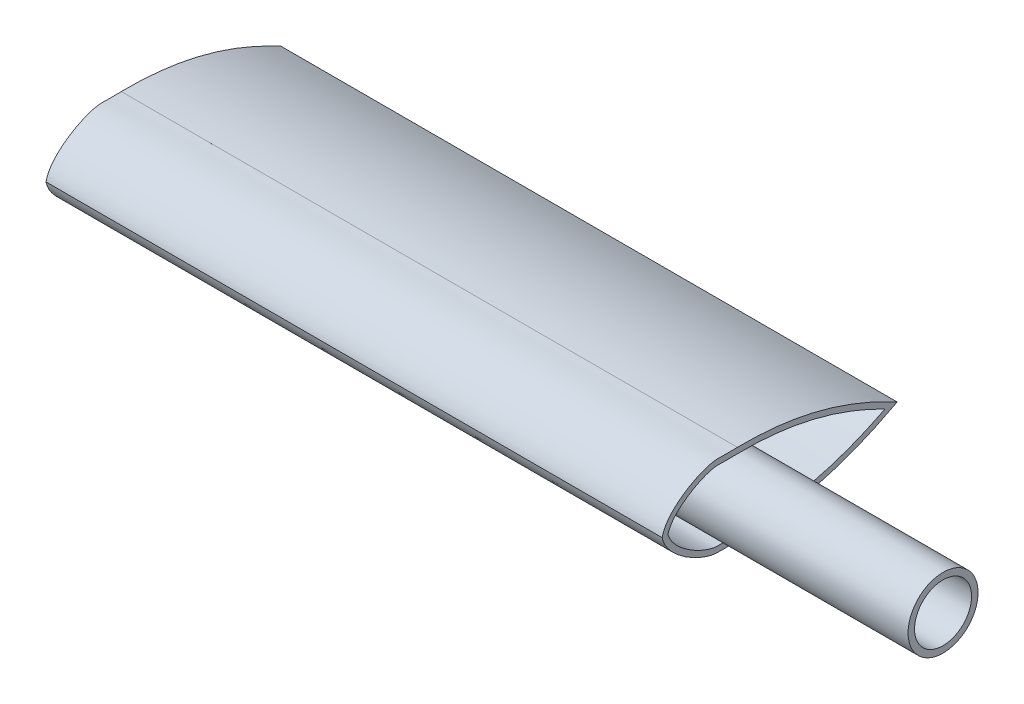
ISO-10303-21;
HEADER;
FILE_DESCRIPTION(('STEP AP214'),'2;1');
FILE_NAME('part.step','',(''),(''),'','','');
FILE_SCHEMA(('AUTOMOTIVE_DESIGN { 1 0 10303 214 1 1 1 1 }'));
ENDSEC;
DATA;
#1=APPLICATION_CONTEXT('core data for automotive mechanical design processes');
#2=APPLICATION_PROTOCOL_DEFINITION('international standard','automotive_design',2000,#1);
#3=PRODUCT_CONTEXT('',#1,'mechanical');
#4=PRODUCT('Part','Part','',(#3));
#5=PRODUCT_RELATED_PRODUCT_CATEGORY('part','',(#4));
#6=PRODUCT_DEFINITION_FORMATION('','',#4);
#7=PRODUCT_DEFINITION_CONTEXT('part definition',#1,'design');
#8=PRODUCT_DEFINITION('design','',#6,#7);
#9=PRODUCT_DEFINITION_SHAPE('','',#8);
#10=(LENGTH_UNIT() NAMED_UNIT(*) SI_UNIT(.MILLI.,.METRE.));
#11=(NAMED_UNIT(*) PLANE_ANGLE_UNIT() SI_UNIT($,.RADIAN.));
#12=(NAMED_UNIT(*) SI_UNIT($,.STERADIAN.) SOLID_ANGLE_UNIT());
#13=UNCERTAINTY_MEASURE_WITH_UNIT(LENGTH_MEASURE(1.E-05),#10,'distance_accuracy_value','');
#14=(GEOMETRIC_REPRESENTATION_CONTEXT(3) GLOBAL_UNCERTAINTY_ASSIGNED_CONTEXT((#13)) GLOBAL_UNIT_ASSIGNED_CONTEXT((#10,
#11,#12)) REPRESENTATION_CONTEXT('',''));
#15=CARTESIAN_POINT('',(0.,0.,0.));
#16=DIRECTION('',(0.,0.,1.));
#17=DIRECTION('',(1.,0.,0.));
#18=AXIS2_PLACEMENT_3D('',#15,#16,#17);
#19=CARTESIAN_POINT('',(52.02535704593,9.20715614920474,0.0324189138582508));
#20=CARTESIAN_POINT('',(52.02535704593,9.2545678789651,-3.12152695135499));
#21=CARTESIAN_POINT('',(52.02535704593,9.11059405651158,-6.26810860237042));
#22=CARTESIAN_POINT('',(52.02535704593,8.56973641400707,-10.9681085023738));
#23=CARTESIAN_POINT('',(52.02535704593,8.33627501275821,-12.5252170595591));
#24=CARTESIAN_POINT('',(52.02535704593,7.76137535616036,-15.6200257885336));
#25=CARTESIAN_POINT('',(52.02535704593,7.41957392528799,-17.1590894187303));
#26=CARTESIAN_POINT('',(52.02535704593,6.23425482299172,-21.7380864808637));
#27=CARTESIAN_POINT('',(52.02535704593,5.23448895790792,-24.724357096829));
#28=CARTESIAN_POINT('',(52.02535704593,3.45107168212743,-29.1057516055092));
#29=CARTESIAN_POINT('',(52.02535704593,2.8115402581163,-30.5449777205745));
#30=CARTESIAN_POINT('',(52.02535704593,1.79028170997367,-32.67461115866));
#31=CARTESIAN_POINT('',(52.02535704593,1.43867214479019,-33.3792145014387));
#32=CARTESIAN_POINT('',(52.02535704593,0.719336072395418,-34.7808244083903));
#33=CARTESIAN_POINT('',(52.02535704593,0.359668036198041,-35.4816293618661));
#34=CARTESIAN_POINT('',(52.0253570459299,6.60281536791516E-13,-36.1824343153419));
#35=B_SPLINE_CURVE_WITH_KNOTS('',3,(#19,#20,#21,#22,#23,#24,#25,#26,#27,#28,#29,#30,#31,#32,#33,
#34),.UNSPECIFIED.,.F.,.F.,(4,2,2,2,2,2,2,4),(0.,0.25,0.375,0.5,0.75,0.875,0.9375,1.),.UNSPECIFIED.);
#36=DIRECTION('',(-1.,0.,0.));
#37=VECTOR('',#36,1.);
#38=SURFACE_OF_LINEAR_EXTRUSION('',#35,#37);
#39=CARTESIAN_POINT('',(-87.67464295407,9.20715614920474,0.0324189138583322));
#40=CARTESIAN_POINT('',(-87.67464295407,9.25456787896511,-3.12152695135491));
#41=CARTESIAN_POINT('',(-87.67464295407,9.11059405651159,-6.26810860237034));
#42=CARTESIAN_POINT('',(-87.67464295407,8.56973641400708,-10.9681085023737));
#43=CARTESIAN_POINT('',(-87.67464295407,8.33627501275821,-12.525217059559));
#44=CARTESIAN_POINT('',(-87.67464295407,7.76137535616036,-15.6200257885336));
#45=CARTESIAN_POINT('',(-87.67464295407,7.419573925288,-17.1590894187302));
#46=CARTESIAN_POINT('',(-87.67464295407,6.23425482299173,-21.7380864808636));
#47=CARTESIAN_POINT('',(-87.67464295407,5.23448895790793,-24.7243570968289));
#48=CARTESIAN_POINT('',(-87.67464295407,3.45107168212744,-29.1057516055091));
#49=CARTESIAN_POINT('',(-87.67464295407,2.81154025811631,-30.5449777205744));
#50=CARTESIAN_POINT('',(-87.67464295407,1.79028170997367,-32.6746111586599));
#51=CARTESIAN_POINT('',(-87.67464295407,1.4386721447902,-33.3792145014386));
#52=CARTESIAN_POINT('',(-87.67464295407,0.719336072395424,-34.7808244083902));
#53=CARTESIAN_POINT('',(-87.67464295407,0.359668036198047,-35.481629361866));
#54=CARTESIAN_POINT('',(-87.6746429540701,6.66097717661771E-13,-36.1824343153418));
#55=B_SPLINE_CURVE_WITH_KNOTS('',3,(#39,#40,#41,#42,#43,#44,#45,#46,#47,#48,#49,#50,#51,#52,#53,
#54),.UNSPECIFIED.,.F.,.F.,(4,2,2,2,2,2,2,4),(0.,0.25,0.375,0.5,0.75,0.875,0.9375,1.),.UNSPECIFIED.);
#56=CARTESIAN_POINT('',(-87.67464295407,9.20715614920474,0.0324189138583322));
#57=VERTEX_POINT('',#56);
#58=CARTESIAN_POINT('',(-87.6746429540701,6.66097717661771E-13,-36.1824343153418));
#59=VERTEX_POINT('',#58);
#60=EDGE_CURVE('E252',#57,#59,#55,.T.);
#61=ORIENTED_EDGE('',*,*,#60,.F.);
#62=DIRECTION('',(-1.,0.,0.));
#63=VECTOR('',#62,1.);
#64=CARTESIAN_POINT('',(52.02535704593,9.20715614920474,0.0324189138582508));
#65=LINE('',#64,#63);
#66=CARTESIAN_POINT('',(52.02535704593,9.20715614920474,0.0324189138582508));
#67=VERTEX_POINT('',#66);
#68=EDGE_CURVE('E14',#67,#57,#65,.T.);
#69=ORIENTED_EDGE('',*,*,#68,.F.);
#70=CARTESIAN_POINT('',(52.0253570459299,6.60281536791516E-13,-36.1824343153419));
#71=VERTEX_POINT('',#70);
#72=EDGE_CURVE('E288',#67,#71,#35,.T.);
#73=ORIENTED_EDGE('',*,*,#72,.T.);
#74=DIRECTION('',(-1.,0.,0.));
#75=VECTOR('',#74,1.);
#76=CARTESIAN_POINT('',(52.0253570459299,6.60281536791516E-13,-36.1824343153419));
#77=LINE('',#76,#75);
#78=EDGE_CURVE('E120',#71,#59,#77,.T.);
#79=ORIENTED_EDGE('',*,*,#78,.T.);
#80=EDGE_LOOP('',(#61,#69,#73,#79));
#81=FACE_BOUND('',#80,.T.);
#82=ADVANCED_FACE('F116',(#81),#38,.T.);
#83=CARTESIAN_POINT('',(52.02535704593,-2.67958153181949E-13,17.1020945624622));
#84=CARTESIAN_POINT('',(52.02535704593,0.21379701608967,17.0473970201368));
#85=CARTESIAN_POINT('',(52.02535704593,0.428807060053158,16.9953368193116));
#86=CARTESIAN_POINT('',(52.02535704593,0.845636752605477,16.8625381177768));
#87=CARTESIAN_POINT('',(52.02535704593,1.04900235125496,16.7851607914813));
#88=CARTESIAN_POINT('',(52.02535704593,1.64604130883234,16.5246387155574));
#89=CARTESIAN_POINT('',(52.02535704593,2.02675755334856,16.313322860956));
#90=CARTESIAN_POINT('',(52.02535704593,2.57750067721146,15.9521452879863));
#91=CARTESIAN_POINT('',(52.02535704593,2.75829823647483,15.8237992660148));
#92=CARTESIAN_POINT('',(52.02535704593,3.10889431206553,15.5574788202781));
#93=CARTESIAN_POINT('',(52.02535704593,3.27912106073891,15.4192966055391));
#94=CARTESIAN_POINT('',(52.02535704593,3.77673202343124,14.9918077225645));
#95=CARTESIAN_POINT('',(52.02535704593,4.09116225350915,14.6896729941496));
#96=CARTESIAN_POINT('',(52.02535704593,4.69287297619097,14.0585177184276));
#97=CARTESIAN_POINT('',(52.02535704593,4.98009640397582,13.7294406610202));
#98=CARTESIAN_POINT('',(52.02535704593,5.53157218241393,13.0485387675166));
#99=CARTESIAN_POINT('',(52.02535704593,5.79630297980023,12.6958308387991));
#100=CARTESIAN_POINT('',(52.02535704593,6.54982361859308,11.6213864838288));
#101=CARTESIAN_POINT('',(52.02535704593,7.00253711647303,10.879692917482));
#102=CARTESIAN_POINT('',(52.02535704593,7.81841743961152,9.35048507838557));
#103=CARTESIAN_POINT('',(52.02535704593,8.18245890481765,8.56341835571325));
#104=CARTESIAN_POINT('',(52.02535704593,8.64037140527623,7.33771239246274));
#105=CARTESIAN_POINT('',(52.02535704593,8.77848875807355,6.92013183843154));
#106=CARTESIAN_POINT('',(52.02535704593,9.00908377803576,6.06836294532959));
#107=CARTESIAN_POINT('',(52.02535704593,9.10010942656302,5.64121764824237));
#108=CARTESIAN_POINT('',(52.02535704593,9.20377313957187,4.78285505375749));
#109=CARTESIAN_POINT('',(52.02535704593,9.21179223365159,4.35139781467592));
#110=CARTESIAN_POINT('',(52.02535704593,9.19895632193267,3.48698341346884));
#111=CARTESIAN_POINT('',(52.02535704593,9.18910595575575,3.05459790942542));
#112=CARTESIAN_POINT('',(52.02535704593,9.17225102320762,1.75810092510757));
#113=CARTESIAN_POINT('',(52.02535704593,9.1760845525975,0.894552451460282));
#114=CARTESIAN_POINT('',(52.02535704593,9.20715614920474,0.0324189138582443));
#115=B_SPLINE_CURVE_WITH_KNOTS('',3,(#83,#84,#85,#86,#87,#88,#89,#90,#91,#92,#93,#94,#95,#96,
#97,#98,#99,#100,#101,#102,#103,#104,#105,#106,#107,#108,#109,#110,#111,#112,#113,#114),
.UNSPECIFIED.,.F.,.F.,(4,2,2,2,2,2,2,2,2,2,2,2,2,2,2,4),(0.,0.0312499999999999,
0.0624999999999998,0.125,0.15625,0.1875,0.25,0.3125,0.375,0.5,0.625,0.6875,0.75,0.8125,0.875,
1.),.UNSPECIFIED.);
#116=DIRECTION('',(-1.,0.,0.));
#117=VECTOR('',#116,1.);
#118=SURFACE_OF_LINEAR_EXTRUSION('',#115,#117);
#119=CARTESIAN_POINT('',(-87.67464295407,-2.62141972311694E-13,17.1020945624623));
#120=CARTESIAN_POINT('',(-87.67464295407,0.213797016089675,17.0473970201369));
#121=CARTESIAN_POINT('',(-87.67464295407,0.428807060053163,16.9953368193117));
#122=CARTESIAN_POINT('',(-87.67464295407,0.845636752605483,16.8625381177769));
#123=CARTESIAN_POINT('',(-87.67464295407,1.04900235125496,16.7851607914814));
#124=CARTESIAN_POINT('',(-87.67464295407,1.64604130883234,16.5246387155575));
#125=CARTESIAN_POINT('',(-87.67464295407,2.02675755334857,16.3133228609561));
#126=CARTESIAN_POINT('',(-87.67464295407,2.57750067721147,15.9521452879864));
#127=CARTESIAN_POINT('',(-87.67464295407,2.75829823647483,15.8237992660148));
#128=CARTESIAN_POINT('',(-87.67464295407,3.10889431206554,15.5574788202782));
#129=CARTESIAN_POINT('',(-87.67464295407,3.27912106073892,15.4192966055392));
#130=CARTESIAN_POINT('',(-87.67464295407,3.77673202343124,14.9918077225646));
#131=CARTESIAN_POINT('',(-87.67464295407,4.09116225350916,14.6896729941497));
#132=CARTESIAN_POINT('',(-87.67464295407,4.69287297619097,14.0585177184277));
#133=CARTESIAN_POINT('',(-87.67464295407,4.98009640397582,13.7294406610202));
#134=CARTESIAN_POINT('',(-87.67464295407,5.53157218241394,13.0485387675166));
#135=CARTESIAN_POINT('',(-87.67464295407,5.79630297980023,12.6958308387992));
#136=CARTESIAN_POINT('',(-87.67464295407,6.54982361859308,11.6213864838289));
#137=CARTESIAN_POINT('',(-87.67464295407,7.00253711647304,10.8796929174821));
#138=CARTESIAN_POINT('',(-87.67464295407,7.81841743961152,9.35048507838565));
#139=CARTESIAN_POINT('',(-87.67464295407,8.18245890481765,8.56341835571333));
#140=CARTESIAN_POINT('',(-87.67464295407,8.64037140527624,7.33771239246282));
#141=CARTESIAN_POINT('',(-87.67464295407,8.77848875807356,6.92013183843162));
#142=CARTESIAN_POINT('',(-87.67464295407,9.00908377803576,6.06836294532967));
#143=CARTESIAN_POINT('',(-87.67464295407,9.10010942656303,5.64121764824245));
#144=CARTESIAN_POINT('',(-87.67464295407,9.20377313957188,4.78285505375757));
#145=CARTESIAN_POINT('',(-87.67464295407,9.21179223365159,4.351397814676));
#146=CARTESIAN_POINT('',(-87.67464295407,9.19895632193268,3.48698341346892));
#147=CARTESIAN_POINT('',(-87.67464295407,9.18910595575575,3.05459790942551));
#148=CARTESIAN_POINT('',(-87.67464295407,9.17225102320762,1.75810092510765));
#149=CARTESIAN_POINT('',(-87.67464295407,9.17608455259751,0.894552451460364));
#150=CARTESIAN_POINT('',(-87.67464295407,9.20715614920474,0.0324189138583257));
#151=B_SPLINE_CURVE_WITH_KNOTS('',3,(#119,#120,#121,#122,#123,#124,#125,#126,#127,#128,#129,
#130,#131,#132,#133,#134,#135,#136,#137,#138,#139,#140,#141,#142,#143,#144,#145,#146,#147,#148,
#149,#150),.UNSPECIFIED.,.F.,.F.,(4,2,2,2,2,2,2,2,2,2,2,2,2,2,2,4),(0.,0.0312499999999999,
0.0624999999999998,0.125,0.15625,0.1875,0.25,0.3125,0.375,0.5,0.625,0.6875,0.75,0.8125,0.875,
1.),.UNSPECIFIED.);
#152=CARTESIAN_POINT('',(-87.6746429540701,-2.62141972311694E-13,17.1020945624623));
#153=VERTEX_POINT('',#152);
#154=EDGE_CURVE('E280',#153,#57,#151,.T.);
#155=ORIENTED_EDGE('',*,*,#154,.F.);
#156=DIRECTION('',(-1.,0.,0.));
#157=VECTOR('',#156,1.);
#158=CARTESIAN_POINT('',(52.0253570459299,-2.67958153181949E-13,17.1020945624622));
#159=LINE('',#158,#157);
#160=CARTESIAN_POINT('',(52.0253570459299,-2.67958153181949E-13,17.1020945624622));
#161=VERTEX_POINT('',#160);
#162=EDGE_CURVE('E126',#161,#153,#159,.T.);
#163=ORIENTED_EDGE('',*,*,#162,.F.);
#164=EDGE_CURVE('E240',#161,#67,#115,.T.);
#165=ORIENTED_EDGE('',*,*,#164,.T.);
#166=ORIENTED_EDGE('',*,*,#68,.T.);
#167=EDGE_LOOP('',(#155,#163,#165,#166));
#168=FACE_BOUND('',#167,.T.);
#169=ADVANCED_FACE('F233',(#168),#118,.T.);
#170=CARTESIAN_POINT('',(52.02535704593,-9.2071561492044,0.0324189138581618));
#171=CARTESIAN_POINT('',(52.02535704593,-9.17568947588769,0.905514517087878));
#172=CARTESIAN_POINT('',(52.02535704593,-9.17223382694292,1.77912563537707));
#173=CARTESIAN_POINT('',(52.02535704593,-9.18971872879831,3.0899595017245));
#174=CARTESIAN_POINT('',(52.02535704593,-9.20022375925249,3.52699019440415));
#175=CARTESIAN_POINT('',(52.02535704593,-9.2117835079782,4.40087765616157));
#176=CARTESIAN_POINT('',(52.02535704593,-9.20070239747973,4.83751107737435));
#177=CARTESIAN_POINT('',(52.02535704593,-9.11606067068707,5.49120936758472));
#178=CARTESIAN_POINT('',(52.02535704593,-9.07754563261173,5.70915611083959));
#179=CARTESIAN_POINT('',(52.02535704593,-8.98673912995048,6.13723348220495));
#180=CARTESIAN_POINT('',(52.02535704593,-8.93429324667088,6.34850294555812));
#181=CARTESIAN_POINT('',(52.02535704593,-8.7607182750288,6.97592668362344));
#182=CARTESIAN_POINT('',(52.02535704593,-8.62361945324559,7.38580152435279));
#183=CARTESIAN_POINT('',(52.02535704593,-8.16704583868344,8.59762268928329));
#184=CARTESIAN_POINT('',(52.02535704593,-7.80320360130308,9.38212335975801));
#185=CARTESIAN_POINT('',(52.02535704593,-7.1874902045082,10.5313694190035));
#186=CARTESIAN_POINT('',(52.02535704593,-6.9695537394444,10.9105872648037));
#187=CARTESIAN_POINT('',(52.02535704593,-6.51357123522559,11.6516983541814));
#188=CARTESIAN_POINT('',(52.02535704593,-6.27522365782645,12.0142783221228));
#189=CARTESIAN_POINT('',(52.02535704593,-5.52722885875344,13.0766412962924));
#190=CARTESIAN_POINT('',(52.02535704593,-4.98589787049965,13.7520241118218));
#191=CARTESIAN_POINT('',(52.02535704593,-4.08448323345092,14.6962359408568));
#192=CARTESIAN_POINT('',(52.02535704593,-3.76712043798521,15.0006180270843));
#193=CARTESIAN_POINT('',(52.02535704593,-3.10556890090361,15.5678244218203));
#194=CARTESIAN_POINT('',(52.02535704593,-2.76082512459077,15.831634309525));
#195=CARTESIAN_POINT('',(52.02535704593,-2.21661508263406,16.188955161605));
#196=CARTESIAN_POINT('',(52.02535704593,-2.03066602099421,16.3016206259632));
#197=CARTESIAN_POINT('',(52.02535704593,-1.64813078644224,16.5118782786066));
#198=CARTESIAN_POINT('',(52.02535704593,-1.45061194113076,16.6098639219749));
#199=CARTESIAN_POINT('',(52.02535704593,-1.04808859285851,16.7856109231705));
#200=CARTESIAN_POINT('',(52.02535704593,-0.84338243749173,16.8633535259416));
#201=CARTESIAN_POINT('',(52.02535704593,-0.426225712136375,16.9960608825114));
#202=CARTESIAN_POINT('',(52.02535704593,-0.212641898615672,17.0476925438448));
#203=CARTESIAN_POINT('',(52.02535704593,-2.72490887873331E-13,17.1020945624622));
#204=B_SPLINE_CURVE_WITH_KNOTS('',3,(#170,#171,#172,#173,#174,#175,#176,#177,#178,#179,#180,
#181,#182,#183,#184,#185,#186,#187,#188,#189,#190,#191,#192,#193,#194,#195,#196,#197,#198,#199,
#200,#201,#202,#203),.UNSPECIFIED.,.F.,.F.,(4,2,2,2,2,2,2,2,2,2,2,2,2,2,2,2,4),(0.,0.125,0.1875,
0.249999999999999,0.281249999999999,0.3125,0.375,0.5,0.5625,0.625,0.75,0.812499999999999,
0.874999999999999,0.90625,0.9375,0.96875,1.),.UNSPECIFIED.);
#205=DIRECTION('',(-1.,0.,0.));
#206=VECTOR('',#205,1.);
#207=SURFACE_OF_LINEAR_EXTRUSION('',#204,#206);
#208=CARTESIAN_POINT('',(-87.67464295407,-9.2071561492044,0.0324189138582432));
#209=CARTESIAN_POINT('',(-87.67464295407,-9.17568947588769,0.905514517087959));
#210=CARTESIAN_POINT('',(-87.67464295407,-9.17223382694291,1.77912563537715));
#211=CARTESIAN_POINT('',(-87.67464295407,-9.1897187287983,3.08995950172458));
#212=CARTESIAN_POINT('',(-87.67464295407,-9.20022375925249,3.52699019440423));
#213=CARTESIAN_POINT('',(-87.67464295407,-9.2117835079782,4.40087765616165));
#214=CARTESIAN_POINT('',(-87.67464295407,-9.20070239747972,4.83751107737443));
#215=CARTESIAN_POINT('',(-87.67464295407,-9.11606067068707,5.4912093675848));
#216=CARTESIAN_POINT('',(-87.67464295407,-9.07754563261173,5.70915611083967));
#217=CARTESIAN_POINT('',(-87.67464295407,-8.98673912995047,6.13723348220504));
#218=CARTESIAN_POINT('',(-87.67464295407,-8.93429324667088,6.34850294555821));
#219=CARTESIAN_POINT('',(-87.67464295407,-8.7607182750288,6.97592668362352));
#220=CARTESIAN_POINT('',(-87.67464295407,-8.62361945324559,7.38580152435288));
#221=CARTESIAN_POINT('',(-87.67464295407,-8.16704583868343,8.59762268928337));
#222=CARTESIAN_POINT('',(-87.67464295407,-7.80320360130308,9.38212335975809));
#223=CARTESIAN_POINT('',(-87.67464295407,-7.1874902045082,10.5313694190035));
#224=CARTESIAN_POINT('',(-87.67464295407,-6.9695537394444,10.9105872648038));
#225=CARTESIAN_POINT('',(-87.67464295407,-6.51357123522558,11.6516983541815));
#226=CARTESIAN_POINT('',(-87.67464295407,-6.27522365782645,12.0142783221229));
#227=CARTESIAN_POINT('',(-87.67464295407,-5.52722885875344,13.0766412962925));
#228=CARTESIAN_POINT('',(-87.67464295407,-4.98589787049965,13.7520241118219));
#229=CARTESIAN_POINT('',(-87.67464295407,-4.08448323345091,14.6962359408569));
#230=CARTESIAN_POINT('',(-87.67464295407,-3.76712043798521,15.0006180270844));
#231=CARTESIAN_POINT('',(-87.67464295407,-3.10556890090361,15.5678244218204));
#232=CARTESIAN_POINT('',(-87.67464295407,-2.76082512459077,15.8316343095251));
#233=CARTESIAN_POINT('',(-87.67464295407,-2.21661508263405,16.1889551616051));
#234=CARTESIAN_POINT('',(-87.67464295407,-2.03066602099421,16.3016206259633));
#235=CARTESIAN_POINT('',(-87.67464295407,-1.64813078644224,16.5118782786067));
#236=CARTESIAN_POINT('',(-87.67464295407,-1.45061194113075,16.609863921975));
#237=CARTESIAN_POINT('',(-87.67464295407,-1.04808859285851,16.7856109231706));
#238=CARTESIAN_POINT('',(-87.67464295407,-0.843382437491724,16.8633535259417));
#239=CARTESIAN_POINT('',(-87.67464295407,-0.42622571213637,16.9960608825115));
#240=CARTESIAN_POINT('',(-87.67464295407,-0.212641898615666,17.0476925438449));
#241=CARTESIAN_POINT('',(-87.67464295407,-2.66674707003076E-13,17.1020945624623));
#242=B_SPLINE_CURVE_WITH_KNOTS('',3,(#208,#209,#210,#211,#212,#213,#214,#215,#216,#217,#218,
#219,#220,#221,#222,#223,#224,#225,#226,#227,#228,#229,#230,#231,#232,#233,#234,#235,#236,#237,
#238,#239,#240,#241),.UNSPECIFIED.,.F.,.F.,(4,2,2,2,2,2,2,2,2,2,2,2,2,2,2,2,4),(0.,0.125,0.1875,
0.249999999999999,0.281249999999999,0.3125,0.375,0.5,0.5625,0.625,0.75,0.812499999999999,
0.874999999999999,0.90625,0.9375,0.96875,1.),.UNSPECIFIED.);
#243=CARTESIAN_POINT('',(-87.6746429540701,-9.2071561492044,0.0324189138582432));
#244=VERTEX_POINT('',#243);
#245=EDGE_CURVE('E271',#244,#153,#242,.T.);
#246=ORIENTED_EDGE('',*,*,#245,.F.);
#247=DIRECTION('',(-1.,0.,0.));
#248=VECTOR('',#247,1.);
#249=CARTESIAN_POINT('',(52.0253570459299,-9.2071561492044,0.0324189138581618));
#250=LINE('',#249,#248);
#251=CARTESIAN_POINT('',(52.0253570459299,-9.2071561492044,0.0324189138581618));
#252=VERTEX_POINT('',#251);
#253=EDGE_CURVE('E294',#252,#244,#250,.T.);
#254=ORIENTED_EDGE('',*,*,#253,.F.);
#255=EDGE_CURVE('E247',#252,#161,#204,.T.);
#256=ORIENTED_EDGE('',*,*,#255,.T.);
#257=ORIENTED_EDGE('',*,*,#162,.T.);
#258=EDGE_LOOP('',(#246,#254,#256,#257));
#259=FACE_BOUND('',#258,.T.);
#260=ADVANCED_FACE('F237',(#259),#207,.T.);
#261=CARTESIAN_POINT('',(52.0253570459299,6.60281536791516E-13,-36.1824343153419));
#262=CARTESIAN_POINT('',(52.02535704593,-0.359723472093301,-35.4815213462879));
#263=CARTESIAN_POINT('',(52.02535704593,-0.719446944187257,-34.7806083772339));
#264=CARTESIAN_POINT('',(52.02535704593,-1.43889388837518,-33.3787824391258));
#265=CARTESIAN_POINT('',(52.02535704593,-1.79056585666944,-32.6740374275051));
#266=CARTESIAN_POINT('',(52.02535704593,-2.81206322700419,-30.5438495403111));
#267=CARTESIAN_POINT('',(52.02535704593,-3.45204899547115,-29.1034908226069));
#268=CARTESIAN_POINT('',(52.02535704593,-4.64093627892336,-26.1824219077136));
#269=CARTESIAN_POINT('',(52.02535704593,-5.1881556899537,-24.7058751017734));
#270=CARTESIAN_POINT('',(52.02535704593,-6.18284167851504,-21.7189582362438));
#271=CARTESIAN_POINT('',(52.02535704593,-6.6306563442391,-20.2071836306956));
#272=CARTESIAN_POINT('',(52.02535704593,-7.81562489543864,-15.628240432795));
#273=CARTESIAN_POINT('',(52.02535704593,-8.38992897514505,-12.5317304247943));
#274=CARTESIAN_POINT('',(52.02535704593,-9.11075462961608,-6.26559934802882));
#275=CARTESIAN_POINT('',(52.02535704593,-9.25456706456247,-3.12147277529382));
#276=CARTESIAN_POINT('',(52.02535704593,-9.2071561492044,0.0324189138581618));
#277=B_SPLINE_CURVE_WITH_KNOTS('',3,(#261,#262,#263,#264,#265,#266,#267,#268,#269,#270,#271,
#272,#273,#274,#275,#276),.UNSPECIFIED.,.F.,.F.,(4,2,2,2,2,2,2,4),(0.,0.0625,0.125,0.25,0.375,
0.5,0.75,1.),.UNSPECIFIED.);
#278=DIRECTION('',(-1.,0.,0.));
#279=VECTOR('',#278,1.);
#280=SURFACE_OF_LINEAR_EXTRUSION('',#277,#279);
#281=CARTESIAN_POINT('',(-87.6746429540701,6.66097717661771E-13,-36.1824343153418));
#282=CARTESIAN_POINT('',(-87.67464295407,-0.359723472093295,-35.4815213462878));
#283=CARTESIAN_POINT('',(-87.67464295407,-0.719446944187251,-34.7806083772338));
#284=CARTESIAN_POINT('',(-87.67464295407,-1.43889388837517,-33.3787824391258));
#285=CARTESIAN_POINT('',(-87.67464295407,-1.79056585666943,-32.674037427505));
#286=CARTESIAN_POINT('',(-87.67464295407,-2.81206322700418,-30.543849540311));
#287=CARTESIAN_POINT('',(-87.67464295407,-3.45204899547115,-29.1034908226068));
#288=CARTESIAN_POINT('',(-87.67464295407,-4.64093627892336,-26.1824219077135));
#289=CARTESIAN_POINT('',(-87.67464295407,-5.1881556899537,-24.7058751017733));
#290=CARTESIAN_POINT('',(-87.67464295407,-6.18284167851504,-21.7189582362438));
#291=CARTESIAN_POINT('',(-87.67464295407,-6.63065634423909,-20.2071836306955));
#292=CARTESIAN_POINT('',(-87.67464295407,-7.81562489543863,-15.6282404327949));
#293=CARTESIAN_POINT('',(-87.67464295407,-8.38992897514505,-12.5317304247943));
#294=CARTESIAN_POINT('',(-87.67464295407,-9.11075462961608,-6.26559934802874));
#295=CARTESIAN_POINT('',(-87.67464295407,-9.25456706456246,-3.12147277529374));
#296=CARTESIAN_POINT('',(-87.67464295407,-9.2071561492044,0.0324189138582432));
#297=B_SPLINE_CURVE_WITH_KNOTS('',3,(#281,#282,#283,#284,#285,#286,#287,#288,#289,#290,#291,
#292,#293,#294,#295,#296),.UNSPECIFIED.,.F.,.F.,(4,2,2,2,2,2,2,4),(0.,0.0625,0.125,0.25,0.375,
0.5,0.75,1.),.UNSPECIFIED.);
#298=EDGE_CURVE('E261',#59,#244,#297,.T.);
#299=ORIENTED_EDGE('',*,*,#298,.F.);
#300=ORIENTED_EDGE('',*,*,#78,.F.);
#301=EDGE_CURVE('E311',#71,#252,#277,.T.);
#302=ORIENTED_EDGE('',*,*,#301,.T.);
#303=ORIENTED_EDGE('',*,*,#253,.T.);
#304=EDGE_LOOP('',(#299,#300,#302,#303));
#305=FACE_BOUND('',#304,.T.);
#306=ADVANCED_FACE('F229',(#305),#280,.T.);
#307=CARTESIAN_POINT('',(52.02535704593,7.0244675578559,-18.6854217727747));
#308=DIRECTION('',(1.,0.,0.));
#309=DIRECTION('',(0.,0.,-1.));
#310=AXIS2_PLACEMENT_3D('',#307,#308,#309);
#311=PLANE('',#310);
#312=CARTESIAN_POINT('',(52.02535704593,7.93750000000017,0.));
#313=CARTESIAN_POINT('',(52.02535704593,8.11760063281946,-11.9807408224442));
#314=CARTESIAN_POINT('',(52.02535704593,5.46629021684272,-22.7500583661511));
#315=CARTESIAN_POINT('',(52.02535704593,5.9110943818694E-13,-33.4009999999999));
#316=B_SPLINE_CURVE_WITH_KNOTS('',3,(#312,#313,#314,#315),.UNSPECIFIED.,.F.,.F.,(4,4),(0.,1.),.UNSPECIFIED.);
#317=CARTESIAN_POINT('',(52.02535704593,7.93750000000017,0.));
#318=VERTEX_POINT('',#317);
#319=CARTESIAN_POINT('',(52.02535704593,5.9110943818694E-13,-33.4009999999999));
#320=VERTEX_POINT('',#319);
#321=EDGE_CURVE('E185',#318,#320,#316,.T.);
#322=ORIENTED_EDGE('',*,*,#321,.T.);
#323=CARTESIAN_POINT('',(52.02535704593,5.9110943818694E-13,-33.4009999999999));
#324=CARTESIAN_POINT('',(52.02535704593,-5.46629021684193,-22.7500583661517));
#325=CARTESIAN_POINT('',(52.02535704593,-8.11760063281913,-11.9807408224442));
#326=CARTESIAN_POINT('',(52.02535704593,-7.93749999999983,0.));
#327=B_SPLINE_CURVE_WITH_KNOTS('',3,(#323,#324,#325,#326),.UNSPECIFIED.,.F.,.F.,(4,4),(0.,1.),.UNSPECIFIED.);
#328=CARTESIAN_POINT('',(52.02535704593,-7.93749999999983,0.));
#329=VERTEX_POINT('',#328);
#330=EDGE_CURVE('E195',#320,#329,#327,.T.);
#331=ORIENTED_EDGE('',*,*,#330,.T.);
#332=CARTESIAN_POINT('',(52.02535704593,-7.93749999999983,0.));
#333=CARTESIAN_POINT('',(52.02535704593,-7.88451384743213,1.47018963121071));
#334=CARTESIAN_POINT('',(52.02535704593,-7.92593053810755,3.2292732069196));
#335=CARTESIAN_POINT('',(52.02535704593,-7.98902906903374,7.44161801849536));
#336=CARTESIAN_POINT('',(52.02535704593,-3.80414762291383,14.8179423282001));
#337=CARTESIAN_POINT('',(52.02535704593,-2.3023157112819E-13,15.7911903623485));
#338=B_SPLINE_CURVE_WITH_KNOTS('',3,(#332,#333,#334,#335,#336,#337),.UNSPECIFIED.,.F.,.F.,(4,1,
1,4),(0.,0.236691734828959,0.336691734828958,1.),.UNSPECIFIED.);
#339=CARTESIAN_POINT('',(52.02535704593,-3.15335504651605E-13,15.7911903623485));
#340=VERTEX_POINT('',#339);
#341=EDGE_CURVE('E134',#329,#340,#338,.T.);
#342=ORIENTED_EDGE('',*,*,#341,.T.);
#343=CARTESIAN_POINT('',(52.02535704593,-3.15335504651605E-13,15.7911903623485));
#344=CARTESIAN_POINT('',(52.02535704593,3.80414762291328,14.8179423282001));
#345=CARTESIAN_POINT('',(52.02535704593,7.98902906903384,7.4416180184955));
#346=CARTESIAN_POINT('',(52.02535704593,7.92593053810732,3.22927320691993));
#347=CARTESIAN_POINT('',(52.02535704593,7.88451384743246,1.47018963121071));
#348=CARTESIAN_POINT('',(52.02535704593,7.93750000000017,0.));
#349=B_SPLINE_CURVE_WITH_KNOTS('',3,(#343,#344,#345,#346,#347,#348),.UNSPECIFIED.,.F.,.F.,(4,1,
1,4),(0.,0.663308265171042,0.763308265171041,1.),.UNSPECIFIED.);
#350=EDGE_CURVE('E192',#340,#318,#349,.T.);
#351=ORIENTED_EDGE('',*,*,#350,.T.);
#352=EDGE_LOOP('',(#322,#331,#342,#351));
#353=FACE_BOUND('',#352,.T.);
#354=ORIENTED_EDGE('',*,*,#72,.F.);
#355=ORIENTED_EDGE('',*,*,#164,.F.);
#356=ORIENTED_EDGE('',*,*,#255,.F.);
#357=ORIENTED_EDGE('',*,*,#301,.F.);
#358=EDGE_LOOP('',(#354,#355,#356,#357));
#359=FACE_BOUND('',#358,.T.);
#360=ADVANCED_FACE('F200',(#353,#359),#311,.T.);
#361=CARTESIAN_POINT('',(-87.67464295407,7.02446755785591,-18.6854217727747));
#362=DIRECTION('',(1.,0.,0.));
#363=DIRECTION('',(0.,0.,-1.));
#364=AXIS2_PLACEMENT_3D('',#361,#362,#363);
#365=PLANE('',#364);
#366=CARTESIAN_POINT('',(-87.67464295407,5.96925619057195E-13,-33.4009999999998));
#367=CARTESIAN_POINT('',(-87.67464295407,-5.46629021684192,-22.7500583661516));
#368=CARTESIAN_POINT('',(-87.67464295407,-8.11760063281912,-11.9807408224441));
#369=CARTESIAN_POINT('',(-87.67464295407,-7.93749999999983,0.));
#370=B_SPLINE_CURVE_WITH_KNOTS('',3,(#366,#367,#368,#369),.UNSPECIFIED.,.F.,.F.,(4,4),(0.,1.),.UNSPECIFIED.);
#371=CARTESIAN_POINT('',(-87.67464295407,5.96925619057195E-13,-33.4009999999998));
#372=VERTEX_POINT('',#371);
#373=CARTESIAN_POINT('',(-87.67464295407,-7.93749999999983,0.));
#374=VERTEX_POINT('',#373);
#375=EDGE_CURVE('E414',#372,#374,#370,.T.);
#376=ORIENTED_EDGE('',*,*,#375,.F.);
#377=CARTESIAN_POINT('',(-87.67464295407,7.93750000000017,0.));
#378=CARTESIAN_POINT('',(-87.67464295407,8.11760063281947,-11.9807408224441));
#379=CARTESIAN_POINT('',(-87.67464295407,5.46629021684273,-22.750058366151));
#380=CARTESIAN_POINT('',(-87.67464295407,5.96925619057195E-13,-33.4009999999998));
#381=B_SPLINE_CURVE_WITH_KNOTS('',3,(#377,#378,#379,#380),.UNSPECIFIED.,.F.,.F.,(4,4),(0.,1.),.UNSPECIFIED.);
#382=CARTESIAN_POINT('',(-87.67464295407,7.93750000000017,0.));
#383=VERTEX_POINT('',#382);
#384=EDGE_CURVE('E142',#383,#372,#381,.T.);
#385=ORIENTED_EDGE('',*,*,#384,.F.);
#386=CARTESIAN_POINT('',(-87.67464295407,-3.0951932378135E-13,15.7911903623486));
#387=CARTESIAN_POINT('',(-87.67464295407,3.80414762291328,14.8179423282001));
#388=CARTESIAN_POINT('',(-87.67464295407,7.98902906903385,7.44161801849558));
#389=CARTESIAN_POINT('',(-87.67464295407,7.92593053810733,3.22927320692001));
#390=CARTESIAN_POINT('',(-87.67464295407,7.88451384743247,1.47018963121079));
#391=CARTESIAN_POINT('',(-87.67464295407,7.93750000000017,0.));
#392=B_SPLINE_CURVE_WITH_KNOTS('',3,(#386,#387,#388,#389,#390,#391),.UNSPECIFIED.,.F.,.F.,(4,1,
1,4),(0.,0.663308265171042,0.763308265171041,1.),.UNSPECIFIED.);
#393=CARTESIAN_POINT('',(-87.67464295407,-3.0951932378135E-13,15.7911903623486));
#394=VERTEX_POINT('',#393);
#395=EDGE_CURVE('E204',#394,#383,#392,.T.);
#396=ORIENTED_EDGE('',*,*,#395,.F.);
#397=CARTESIAN_POINT('',(-87.67464295407,-7.93749999999983,0.));
#398=CARTESIAN_POINT('',(-87.67464295407,-7.88451384743212,1.47018963121079));
#399=CARTESIAN_POINT('',(-87.67464295407,-7.92593053810754,3.22927320691968));
#400=CARTESIAN_POINT('',(-87.67464295407,-7.98902906903373,7.44161801849544));
#401=CARTESIAN_POINT('',(-87.67464295407,-3.80414762291383,14.8179423282002));
#402=CARTESIAN_POINT('',(-87.67464295407,-2.24415390257935E-13,15.7911903623486));
#403=B_SPLINE_CURVE_WITH_KNOTS('',3,(#397,#398,#399,#400,#401,#402),.UNSPECIFIED.,.F.,.F.,(4,1,
1,4),(0.,0.236691734828959,0.336691734828958,1.),.UNSPECIFIED.);
#404=EDGE_CURVE('E208',#374,#394,#403,.T.);
#405=ORIENTED_EDGE('',*,*,#404,.F.);
#406=EDGE_LOOP('',(#376,#385,#396,#405));
#407=FACE_BOUND('',#406,.T.);
#408=ORIENTED_EDGE('',*,*,#60,.T.);
#409=ORIENTED_EDGE('',*,*,#298,.T.);
#410=ORIENTED_EDGE('',*,*,#245,.T.);
#411=ORIENTED_EDGE('',*,*,#154,.T.);
#412=EDGE_LOOP('',(#408,#409,#410,#411));
#413=FACE_BOUND('',#412,.T.);
#414=ADVANCED_FACE('F225',(#407,#413),#365,.F.);
#415=DIRECTION('',(-1.,0.,0.));
#416=VECTOR('',#415,1.);
#417=SURFACE_OF_LINEAR_EXTRUSION('',#316,#416);
#418=ORIENTED_EDGE('',*,*,#384,.T.);
#419=DIRECTION('',(-1.,0.,0.));
#420=VECTOR('',#419,1.);
#421=CARTESIAN_POINT('',(52.02535704593,5.9110943818694E-13,-33.4009999999999));
#422=LINE('',#421,#420);
#423=EDGE_CURVE('E181',#320,#372,#422,.T.);
#424=ORIENTED_EDGE('',*,*,#423,.F.);
#425=ORIENTED_EDGE('',*,*,#321,.F.);
#426=DIRECTION('',(-1.,0.,0.));
#427=VECTOR('',#426,1.);
#428=CARTESIAN_POINT('',(52.02535704593,7.93750000000017,0.));
#429=LINE('',#428,#427);
#430=EDGE_CURVE('E262',#318,#383,#429,.T.);
#431=ORIENTED_EDGE('',*,*,#430,.T.);
#432=EDGE_LOOP('',(#418,#424,#425,#431));
#433=FACE_BOUND('',#432,.T.);
#434=ADVANCED_FACE('F183',(#433),#417,.F.);
#435=DIRECTION('',(-1.,0.,0.));
#436=VECTOR('',#435,1.);
#437=SURFACE_OF_LINEAR_EXTRUSION('',#349,#436);
#438=ORIENTED_EDGE('',*,*,#395,.T.);
#439=ORIENTED_EDGE('',*,*,#430,.F.);
#440=ORIENTED_EDGE('',*,*,#350,.F.);
#441=DIRECTION('',(-1.,0.,0.));
#442=VECTOR('',#441,1.);
#443=CARTESIAN_POINT('',(52.02535704593,-3.15335504651605E-13,15.7911903623485));
#444=LINE('',#443,#442);
#445=EDGE_CURVE('E439',#340,#394,#444,.T.);
#446=ORIENTED_EDGE('',*,*,#445,.T.);
#447=EDGE_LOOP('',(#438,#439,#440,#446));
#448=FACE_BOUND('',#447,.T.);
#449=ADVANCED_FACE('F224',(#448),#437,.F.);
#450=DIRECTION('',(-1.,0.,0.));
#451=VECTOR('',#450,1.);
#452=SURFACE_OF_LINEAR_EXTRUSION('',#338,#451);
#453=ORIENTED_EDGE('',*,*,#404,.T.);
#454=ORIENTED_EDGE('',*,*,#445,.F.);
#455=ORIENTED_EDGE('',*,*,#341,.F.);
#456=DIRECTION('',(-1.,0.,0.));
#457=VECTOR('',#456,1.);
#458=CARTESIAN_POINT('',(52.02535704593,-7.93749999999983,0.));
#459=LINE('',#458,#457);
#460=EDGE_CURVE('E191',#329,#374,#459,.T.);
#461=ORIENTED_EDGE('',*,*,#460,.T.);
#462=EDGE_LOOP('',(#453,#454,#455,#461));
#463=FACE_BOUND('',#462,.T.);
#464=ADVANCED_FACE('F374',(#463),#452,.F.);
#465=DIRECTION('',(-1.,0.,0.));
#466=VECTOR('',#465,1.);
#467=SURFACE_OF_LINEAR_EXTRUSION('',#327,#466);
#468=ORIENTED_EDGE('',*,*,#375,.T.);
#469=ORIENTED_EDGE('',*,*,#460,.F.);
#470=ORIENTED_EDGE('',*,*,#330,.F.);
#471=ORIENTED_EDGE('',*,*,#423,.T.);
#472=EDGE_LOOP('',(#468,#469,#470,#471));
#473=FACE_BOUND('',#472,.T.);
#474=ADVANCED_FACE('F196',(#473),#467,.F.);
#475=CLOSED_SHELL('',(#82,#169,#260,#306,#360,#414,#434,#449,#464,#474));
#476=MANIFOLD_SOLID_BREP('B2',#475);
#477=CARTESIAN_POINT('',(165.510963462816,0.,0.));
#478=DIRECTION('',(-1.,0.,0.));
#479=DIRECTION('',(0.,0.,1.));
#480=AXIS2_PLACEMENT_3D('',#477,#478,#479);
#481=CYLINDRICAL_SURFACE('',#480,7.9375);
#482=CARTESIAN_POINT('',(98.6103231601427,0.,0.));
#483=DIRECTION('',(-1.,0.,0.));
#484=DIRECTION('',(0.,0.,1.));
#485=AXIS2_PLACEMENT_3D('',#482,#483,#484);
#486=CIRCLE('',#485,7.9375);
#487=CARTESIAN_POINT('',(98.6103231601427,0.,7.9375));
#488=VERTEX_POINT('',#487);
#489=EDGE_CURVE('E465',#488,#488,#486,.T.);
#490=ORIENTED_EDGE('',*,*,#489,.T.);
#491=EDGE_LOOP('',(#490));
#492=FACE_BOUND('',#491,.T.);
#493=CARTESIAN_POINT('',(-87.67464295407,-1.66136895907165E-13,2.27596413937547E-13));
#494=DIRECTION('',(1.,0.,0.));
#495=DIRECTION('',(0.,0.,-1.));
#496=AXIS2_PLACEMENT_3D('',#493,#494,#495);
#497=CIRCLE('',#496,7.9375);
#498=CARTESIAN_POINT('',(-87.67464295407,-1.66412283258976E-13,-7.93749999999977));
#499=VERTEX_POINT('',#498);
#500=EDGE_CURVE('E469',#499,#499,#497,.T.);
#501=ORIENTED_EDGE('',*,*,#500,.T.);
#502=EDGE_LOOP('',(#501));
#503=FACE_BOUND('',#502,.T.);
#504=ADVANCED_FACE('F458',(#492,#503),#481,.T.);
#505=CARTESIAN_POINT('',(165.510963462816,0.,0.));
#506=DIRECTION('',(-1.,0.,0.));
#507=DIRECTION('',(0.,0.,1.));
#508=AXIS2_PLACEMENT_3D('',#505,#506,#507);
#509=CYLINDRICAL_SURFACE('',#508,6.4643);
#510=CARTESIAN_POINT('',(98.6103231601427,0.,0.));
#511=DIRECTION('',(-1.,0.,0.));
#512=DIRECTION('',(0.,0.,1.));
#513=AXIS2_PLACEMENT_3D('',#510,#511,#512);
#514=CIRCLE('',#513,6.4643);
#515=CARTESIAN_POINT('',(98.6103231601427,0.,6.4643));
#516=VERTEX_POINT('',#515);
#517=EDGE_CURVE('E115',#516,#516,#514,.T.);
#518=ORIENTED_EDGE('',*,*,#517,.F.);
#519=EDGE_LOOP('',(#518));
#520=FACE_BOUND('',#519,.T.);
#521=CARTESIAN_POINT('',(-87.67464295407,-1.66136895907165E-13,2.27596413937547E-13));
#522=DIRECTION('',(1.,0.,0.));
#523=DIRECTION('',(0.,0.,-1.));
#524=AXIS2_PLACEMENT_3D('',#521,#522,#523);
#525=CIRCLE('',#524,6.4643);
#526=CARTESIAN_POINT('',(-87.67464295407,-1.6636117136648E-13,-6.46429999999977));
#527=VERTEX_POINT('',#526);
#528=EDGE_CURVE('E473',#527,#527,#525,.T.);
#529=ORIENTED_EDGE('',*,*,#528,.F.);
#530=EDGE_LOOP('',(#529));
#531=FACE_BOUND('',#530,.T.);
#532=ADVANCED_FACE('F482',(#520,#531),#509,.F.);
#533=CARTESIAN_POINT('',(98.6103231601427,-4.7625,2.1524775964989E-13));
#534=DIRECTION('',(-1.,0.,0.));
#535=DIRECTION('',(0.,0.,1.));
#536=AXIS2_PLACEMENT_3D('',#533,#534,#535);
#537=PLANE('',#536);
#538=ORIENTED_EDGE('',*,*,#517,.T.);
#539=EDGE_LOOP('',(#538));
#540=FACE_BOUND('',#539,.T.);
#541=ORIENTED_EDGE('',*,*,#489,.F.);
#542=EDGE_LOOP('',(#541));
#543=FACE_BOUND('',#542,.T.);
#544=ADVANCED_FACE('F460',(#540,#543),#537,.F.);
#545=CARTESIAN_POINT('',(-87.67464295407,-1.66136895907165E-13,2.27596413937547E-13));
#546=DIRECTION('',(1.,0.,0.));
#547=DIRECTION('',(0.,0.,-1.));
#548=AXIS2_PLACEMENT_3D('',#545,#546,#547);
#549=PLANE('',#548);
#550=ORIENTED_EDGE('',*,*,#528,.T.);
#551=EDGE_LOOP('',(#550));
#552=FACE_BOUND('',#551,.T.);
#553=ORIENTED_EDGE('',*,*,#500,.F.);
#554=EDGE_LOOP('',(#553));
#555=FACE_BOUND('',#554,.T.);
#556=ADVANCED_FACE('F479',(#552,#555),#549,.F.);
#557=CLOSED_SHELL('',(#504,#532,#544,#556));
#558=MANIFOLD_SOLID_BREP('B8_NOT_SHOWN',#557);
#559=ADVANCED_BREP_SHAPE_REPRESENTATION('',(#18,#476,#558),#14);
#560=SHAPE_DEFINITION_REPRESENTATION(#9,#559);
ENDSEC;
END-ISO-10303-21;
